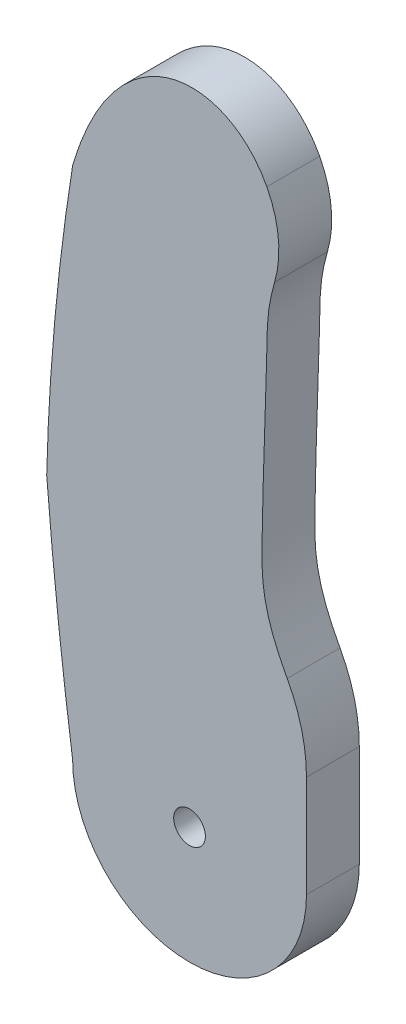
ISO-10303-21;
HEADER;
FILE_DESCRIPTION(('STEP AP214'),'2;1');
FILE_NAME('part.step','',(''),(''),'','','');
FILE_SCHEMA(('AUTOMOTIVE_DESIGN { 1 0 10303 214 1 1 1 1 }'));
ENDSEC;
DATA;
#1=APPLICATION_CONTEXT('core data for automotive mechanical design processes');
#2=APPLICATION_PROTOCOL_DEFINITION('international standard','automotive_design',2000,#1);
#3=PRODUCT_CONTEXT('',#1,'mechanical');
#4=PRODUCT('Part','Part','',(#3));
#5=PRODUCT_RELATED_PRODUCT_CATEGORY('part','',(#4));
#6=PRODUCT_DEFINITION_FORMATION('','',#4);
#7=PRODUCT_DEFINITION_CONTEXT('part definition',#1,'design');
#8=PRODUCT_DEFINITION('design','',#6,#7);
#9=PRODUCT_DEFINITION_SHAPE('','',#8);
#10=(LENGTH_UNIT() NAMED_UNIT(*) SI_UNIT(.MILLI.,.METRE.));
#11=(NAMED_UNIT(*) PLANE_ANGLE_UNIT() SI_UNIT($,.RADIAN.));
#12=(NAMED_UNIT(*) SI_UNIT($,.STERADIAN.) SOLID_ANGLE_UNIT());
#13=UNCERTAINTY_MEASURE_WITH_UNIT(LENGTH_MEASURE(1.E-05),#10,'distance_accuracy_value','');
#14=(GEOMETRIC_REPRESENTATION_CONTEXT(3) GLOBAL_UNCERTAINTY_ASSIGNED_CONTEXT((#13)) GLOBAL_UNIT_ASSIGNED_CONTEXT((#10,
#11,#12)) REPRESENTATION_CONTEXT('',''));
#15=CARTESIAN_POINT('',(0.,0.,0.));
#16=DIRECTION('',(0.,0.,1.));
#17=DIRECTION('',(1.,0.,0.));
#18=AXIS2_PLACEMENT_3D('',#15,#16,#17);
#19=CARTESIAN_POINT('',(-46.6058619597334,0.,5.));
#20=CARTESIAN_POINT('',(-45.7112575391299,-11.0890557128128,5.));
#21=CARTESIAN_POINT('',(-44.1531992134322,-22.0996926023876,5.));
#22=B_SPLINE_CURVE_WITH_KNOTS('',2,(#19,#20,#21),.UNSPECIFIED.,.F.,.F.,(3,3),(0.,1.),.UNSPECIFIED.);
#23=DIRECTION('',(0.,0.,-1.));
#24=VECTOR('',#23,1.);
#25=SURFACE_OF_LINEAR_EXTRUSION('',#22,#24);
#26=CARTESIAN_POINT('',(-46.6058619597334,0.,0.));
#27=CARTESIAN_POINT('',(-45.7112575391299,-11.0890557128128,0.));
#28=CARTESIAN_POINT('',(-44.1531992134322,-22.0996926023876,0.));
#29=B_SPLINE_CURVE_WITH_KNOTS('',2,(#26,#27,#28),.UNSPECIFIED.,.F.,.F.,(3,3),(0.,1.),.UNSPECIFIED.);
#30=CARTESIAN_POINT('',(-46.6058619597334,0.,0.));
#31=VERTEX_POINT('',#30);
#32=CARTESIAN_POINT('',(-44.1531992134322,-22.0996926023876,0.));
#33=VERTEX_POINT('',#32);
#34=EDGE_CURVE('E182',#31,#33,#29,.T.);
#35=ORIENTED_EDGE('',*,*,#34,.T.);
#36=DIRECTION('',(0.,0.,-1.));
#37=VECTOR('',#36,1.);
#38=CARTESIAN_POINT('',(-44.1531992134322,-22.0996926023876,5.));
#39=LINE('',#38,#37);
#40=CARTESIAN_POINT('',(-44.1531992134322,-22.0996926023876,5.));
#41=VERTEX_POINT('',#40);
#42=EDGE_CURVE('E11',#41,#33,#39,.T.);
#43=ORIENTED_EDGE('',*,*,#42,.F.);
#44=CARTESIAN_POINT('',(-46.6058619597334,0.,5.));
#45=VERTEX_POINT('',#44);
#46=EDGE_CURVE('E169',#45,#41,#22,.T.);
#47=ORIENTED_EDGE('',*,*,#46,.F.);
#48=DIRECTION('',(0.,0.,-1.));
#49=VECTOR('',#48,1.);
#50=CARTESIAN_POINT('',(-46.6058619597334,0.,5.));
#51=LINE('',#50,#49);
#52=EDGE_CURVE('E131',#45,#31,#51,.T.);
#53=ORIENTED_EDGE('',*,*,#52,.T.);
#54=EDGE_LOOP('',(#35,#43,#47,#53));
#55=FACE_BOUND('',#54,.T.);
#56=ADVANCED_FACE('F37',(#55),#25,.F.);
#57=CARTESIAN_POINT('',(-33.0893365251508,-22.0996926023876,5.));
#58=DIRECTION('',(0.,0.,-1.));
#59=DIRECTION('',(-1.,0.,0.));
#60=AXIS2_PLACEMENT_3D('',#57,#58,#59);
#61=CYLINDRICAL_SURFACE('',#60,11.0638626882813);
#62=CARTESIAN_POINT('',(-33.0893365251508,-22.0996926023876,0.));
#63=DIRECTION('',(0.,0.,1.));
#64=DIRECTION('',(1.,0.,0.));
#65=AXIS2_PLACEMENT_3D('',#62,#63,#64);
#66=CIRCLE('',#65,11.0638626882813);
#67=CARTESIAN_POINT('',(-22.0254738368695,-22.0996926023876,0.));
#68=VERTEX_POINT('',#67);
#69=EDGE_CURVE('E186',#33,#68,#66,.T.);
#70=ORIENTED_EDGE('',*,*,#69,.T.);
#71=DIRECTION('',(0.,0.,-1.));
#72=VECTOR('',#71,1.);
#73=CARTESIAN_POINT('',(-22.0254738368695,-22.0996926023876,5.));
#74=LINE('',#73,#72);
#75=CARTESIAN_POINT('',(-22.0254738368695,-22.0996926023876,5.));
#76=VERTEX_POINT('',#75);
#77=EDGE_CURVE('E47',#76,#68,#74,.T.);
#78=ORIENTED_EDGE('',*,*,#77,.F.);
#79=CARTESIAN_POINT('',(-33.0893365251508,-22.0996926023876,5.));
#80=DIRECTION('',(0.,0.,1.));
#81=DIRECTION('',(1.,0.,0.));
#82=AXIS2_PLACEMENT_3D('',#79,#80,#81);
#83=CIRCLE('',#82,11.0638626882813);
#84=EDGE_CURVE('E98',#41,#76,#83,.T.);
#85=ORIENTED_EDGE('',*,*,#84,.F.);
#86=ORIENTED_EDGE('',*,*,#42,.T.);
#87=EDGE_LOOP('',(#70,#78,#85,#86));
#88=FACE_BOUND('',#87,.T.);
#89=ADVANCED_FACE('F244',(#88),#61,.T.);
#90=CARTESIAN_POINT('',(-22.0254738368695,-12.4602884320922,5.));
#91=DIRECTION('',(-1.,0.,0.));
#92=DIRECTION('',(0.,-1.,0.));
#93=AXIS2_PLACEMENT_3D('',#90,#91,#92);
#94=PLANE('',#93);
#95=DIRECTION('',(0.,1.,0.));
#96=VECTOR('',#95,1.);
#97=CARTESIAN_POINT('',(-22.0254738368695,-12.4602884320922,0.));
#98=LINE('',#97,#96);
#99=CARTESIAN_POINT('',(-22.0254738368695,-12.4602884320922,0.));
#100=VERTEX_POINT('',#99);
#101=EDGE_CURVE('E190',#68,#100,#98,.T.);
#102=ORIENTED_EDGE('',*,*,#101,.T.);
#103=DIRECTION('',(0.,0.,-1.));
#104=VECTOR('',#103,1.);
#105=CARTESIAN_POINT('',(-22.0254738368695,-12.4602884320922,5.));
#106=LINE('',#105,#104);
#107=CARTESIAN_POINT('',(-22.0254738368695,-12.4602884320922,5.));
#108=VERTEX_POINT('',#107);
#109=EDGE_CURVE('E227',#108,#100,#106,.T.);
#110=ORIENTED_EDGE('',*,*,#109,.F.);
#111=DIRECTION('',(0.,1.,0.));
#112=VECTOR('',#111,1.);
#113=CARTESIAN_POINT('',(-22.0254738368695,-12.4602884320922,5.));
#114=LINE('',#113,#112);
#115=EDGE_CURVE('E167',#76,#108,#114,.T.);
#116=ORIENTED_EDGE('',*,*,#115,.F.);
#117=ORIENTED_EDGE('',*,*,#77,.T.);
#118=EDGE_LOOP('',(#102,#110,#116,#117));
#119=FACE_BOUND('',#118,.T.);
#120=ADVANCED_FACE('F234',(#119),#94,.F.);
#121=CARTESIAN_POINT('',(-37.0254738368695,-12.4602884320922,5.));
#122=DIRECTION('',(0.,0.,-1.));
#123=DIRECTION('',(-1.,0.,0.));
#124=AXIS2_PLACEMENT_3D('',#121,#122,#123);
#125=CYLINDRICAL_SURFACE('',#124,15.);
#126=CARTESIAN_POINT('',(-37.0254738368695,-12.4602884320922,0.));
#127=DIRECTION('',(0.,0.,1.));
#128=DIRECTION('',(-1.,0.,0.));
#129=AXIS2_PLACEMENT_3D('',#126,#127,#128);
#130=CIRCLE('',#129,15.);
#131=CARTESIAN_POINT('',(-23.8517565290266,-5.28720176782827,0.));
#132=VERTEX_POINT('',#131);
#133=EDGE_CURVE('E199',#100,#132,#130,.T.);
#134=ORIENTED_EDGE('',*,*,#133,.T.);
#135=DIRECTION('',(0.,0.,-1.));
#136=VECTOR('',#135,1.);
#137=CARTESIAN_POINT('',(-23.8517565290266,-5.28720176782827,5.));
#138=LINE('',#137,#136);
#139=CARTESIAN_POINT('',(-23.8517565290266,-5.28720176782827,5.));
#140=VERTEX_POINT('',#139);
#141=EDGE_CURVE('E224',#140,#132,#138,.T.);
#142=ORIENTED_EDGE('',*,*,#141,.F.);
#143=CARTESIAN_POINT('',(-37.0254738368695,-12.4602884320922,5.));
#144=DIRECTION('',(0.,0.,1.));
#145=DIRECTION('',(-1.,0.,0.));
#146=AXIS2_PLACEMENT_3D('',#143,#144,#145);
#147=CIRCLE('',#146,15.);
#148=EDGE_CURVE('E162',#108,#140,#147,.T.);
#149=ORIENTED_EDGE('',*,*,#148,.F.);
#150=ORIENTED_EDGE('',*,*,#109,.T.);
#151=EDGE_LOOP('',(#134,#142,#149,#150));
#152=FACE_BOUND('',#151,.T.);
#153=ADVANCED_FACE('F155',(#152),#125,.T.);
#154=CARTESIAN_POINT('',(-23.8517565290266,-5.28720176782827,5.));
#155=CARTESIAN_POINT('',(-26.2502571445017,-0.882240479911318,5.));
#156=CARTESIAN_POINT('',(-26.3074678451786,6.66899426599062,5.));
#157=CARTESIAN_POINT('',(-25.7197092182071,19.5048144764915,5.));
#158=CARTESIAN_POINT('',(-25.7600158726406,24.1411649653781,5.));
#159=CARTESIAN_POINT('',(-25.0422914726888,26.5821550938128,5.));
#160=B_SPLINE_CURVE_WITH_KNOTS('',3,(#154,#155,#156,#157,#158,#159),.UNSPECIFIED.,.F.,.F.,(4,1,
1,4),(0.0833383882535382,0.303134571149601,0.731012854933656,0.959193523349881),.UNSPECIFIED.);
#161=DIRECTION('',(0.,0.,-1.));
#162=VECTOR('',#161,1.);
#163=SURFACE_OF_LINEAR_EXTRUSION('',#160,#162);
#164=CARTESIAN_POINT('',(-23.8517565290266,-5.28720176782827,0.));
#165=CARTESIAN_POINT('',(-26.2502571445017,-0.882240479911318,0.));
#166=CARTESIAN_POINT('',(-26.3074678451786,6.66899426599062,0.));
#167=CARTESIAN_POINT('',(-25.7197092182071,19.5048144764915,0.));
#168=CARTESIAN_POINT('',(-25.7600158726406,24.1411649653781,0.));
#169=CARTESIAN_POINT('',(-25.0422914726888,26.5821550938128,0.));
#170=B_SPLINE_CURVE_WITH_KNOTS('',3,(#164,#165,#166,#167,#168,#169),.UNSPECIFIED.,.F.,.F.,(4,1,
1,4),(0.0833383882535382,0.303134571149601,0.731012854933656,0.959193523349881),.UNSPECIFIED.);
#171=CARTESIAN_POINT('',(-25.0422914726888,26.5821550938128,0.));
#172=VERTEX_POINT('',#171);
#173=EDGE_CURVE('E201',#132,#172,#170,.T.);
#174=ORIENTED_EDGE('',*,*,#173,.T.);
#175=DIRECTION('',(0.,0.,-1.));
#176=VECTOR('',#175,1.);
#177=CARTESIAN_POINT('',(-25.0422914726888,26.5821550938128,5.));
#178=LINE('',#177,#176);
#179=CARTESIAN_POINT('',(-25.0422914726888,26.5821550938128,5.));
#180=VERTEX_POINT('',#179);
#181=EDGE_CURVE('E126',#180,#172,#178,.T.);
#182=ORIENTED_EDGE('',*,*,#181,.F.);
#183=EDGE_CURVE('E117',#140,#180,#160,.T.);
#184=ORIENTED_EDGE('',*,*,#183,.F.);
#185=ORIENTED_EDGE('',*,*,#141,.T.);
#186=EDGE_LOOP('',(#174,#182,#184,#185));
#187=FACE_BOUND('',#186,.T.);
#188=ADVANCED_FACE('F152',(#187),#163,.F.);
#189=CARTESIAN_POINT('',(-34.6361740056399,29.4030446598781,5.));
#190=DIRECTION('',(0.,0.,-1.));
#191=DIRECTION('',(-1.,0.,0.));
#192=AXIS2_PLACEMENT_3D('',#189,#190,#191);
#193=CYLINDRICAL_SURFACE('',#192,10.);
#194=CARTESIAN_POINT('',(-34.6361740056399,29.4030446598781,0.));
#195=DIRECTION('',(0.,0.,1.));
#196=DIRECTION('',(-1.,0.,0.));
#197=AXIS2_PLACEMENT_3D('',#194,#195,#196);
#198=CIRCLE('',#197,10.);
#199=CARTESIAN_POINT('',(-25.7773883152089,34.0422165785523,0.));
#200=VERTEX_POINT('',#199);
#201=EDGE_CURVE('E125',#172,#200,#198,.T.);
#202=ORIENTED_EDGE('',*,*,#201,.T.);
#203=DIRECTION('',(0.,0.,-1.));
#204=VECTOR('',#203,1.);
#205=CARTESIAN_POINT('',(-25.7773883152089,34.0422165785523,5.));
#206=LINE('',#205,#204);
#207=CARTESIAN_POINT('',(-25.7773883152089,34.0422165785523,5.));
#208=VERTEX_POINT('',#207);
#209=EDGE_CURVE('E122',#208,#200,#206,.T.);
#210=ORIENTED_EDGE('',*,*,#209,.F.);
#211=CARTESIAN_POINT('',(-34.6361740056399,29.4030446598781,5.));
#212=DIRECTION('',(0.,0.,1.));
#213=DIRECTION('',(-1.,0.,0.));
#214=AXIS2_PLACEMENT_3D('',#211,#212,#213);
#215=CIRCLE('',#214,10.);
#216=EDGE_CURVE('E111',#180,#208,#215,.T.);
#217=ORIENTED_EDGE('',*,*,#216,.F.);
#218=ORIENTED_EDGE('',*,*,#181,.T.);
#219=EDGE_LOOP('',(#202,#210,#217,#218));
#220=FACE_BOUND('',#219,.T.);
#221=ADVANCED_FACE('F123',(#220),#193,.T.);
#222=CARTESIAN_POINT('',(-25.7773883152089,34.0422165785523,5.));
#223=CARTESIAN_POINT('',(-29.4087069674381,40.9764441255572,5.));
#224=CARTESIAN_POINT('',(-39.9004838670176,41.1834079776446,5.));
#225=CARTESIAN_POINT('',(-44.1531992134322,26.5821550938128,5.));
#226=B_SPLINE_CURVE_WITH_KNOTS('',3,(#222,#223,#224,#225),.UNSPECIFIED.,.F.,.F.,(4,4),(0.,
0.860338306806308),.UNSPECIFIED.);
#227=DIRECTION('',(0.,0.,-1.));
#228=VECTOR('',#227,1.);
#229=SURFACE_OF_LINEAR_EXTRUSION('',#226,#228);
#230=CARTESIAN_POINT('',(-25.7773883152089,34.0422165785523,0.));
#231=CARTESIAN_POINT('',(-29.4087069674381,40.9764441255572,0.));
#232=CARTESIAN_POINT('',(-39.9004838670176,41.1834079776446,0.));
#233=CARTESIAN_POINT('',(-44.1531992134322,26.5821550938128,0.));
#234=B_SPLINE_CURVE_WITH_KNOTS('',3,(#230,#231,#232,#233),.UNSPECIFIED.,.F.,.F.,(4,4),(0.,
0.860338306806308),.UNSPECIFIED.);
#235=CARTESIAN_POINT('',(-44.1531992134322,26.5821550938128,0.));
#236=VERTEX_POINT('',#235);
#237=EDGE_CURVE('E84',#200,#236,#234,.T.);
#238=ORIENTED_EDGE('',*,*,#237,.T.);
#239=DIRECTION('',(0.,0.,-1.));
#240=VECTOR('',#239,1.);
#241=CARTESIAN_POINT('',(-44.1531992134322,26.5821550938128,5.));
#242=LINE('',#241,#240);
#243=CARTESIAN_POINT('',(-44.1531992134322,26.5821550938128,5.));
#244=VERTEX_POINT('',#243);
#245=EDGE_CURVE('E127',#244,#236,#242,.T.);
#246=ORIENTED_EDGE('',*,*,#245,.F.);
#247=EDGE_CURVE('E115',#208,#244,#226,.T.);
#248=ORIENTED_EDGE('',*,*,#247,.F.);
#249=ORIENTED_EDGE('',*,*,#209,.T.);
#250=EDGE_LOOP('',(#238,#246,#248,#249));
#251=FACE_BOUND('',#250,.T.);
#252=ADVANCED_FACE('F129',(#251),#229,.F.);
#253=CARTESIAN_POINT('',(-44.1531992134322,26.5821550938128,5.));
#254=CARTESIAN_POINT('',(-46.2586926234084,13.3744841706048,5.));
#255=CARTESIAN_POINT('',(-46.6058619597334,0.,5.));
#256=B_SPLINE_CURVE_WITH_KNOTS('',2,(#253,#254,#255),.UNSPECIFIED.,.F.,.F.,(3,3),(0.,1.),.UNSPECIFIED.);
#257=DIRECTION('',(0.,0.,-1.));
#258=VECTOR('',#257,1.);
#259=SURFACE_OF_LINEAR_EXTRUSION('',#256,#258);
#260=CARTESIAN_POINT('',(-44.1531992134322,26.5821550938128,0.));
#261=CARTESIAN_POINT('',(-46.2586926234084,13.3744841706048,0.));
#262=CARTESIAN_POINT('',(-46.6058619597334,0.,0.));
#263=B_SPLINE_CURVE_WITH_KNOTS('',2,(#260,#261,#262),.UNSPECIFIED.,.F.,.F.,(3,3),(0.,1.),.UNSPECIFIED.);
#264=EDGE_CURVE('E90',#236,#31,#263,.T.);
#265=ORIENTED_EDGE('',*,*,#264,.T.);
#266=ORIENTED_EDGE('',*,*,#52,.F.);
#267=EDGE_CURVE('E55',#244,#45,#256,.T.);
#268=ORIENTED_EDGE('',*,*,#267,.F.);
#269=ORIENTED_EDGE('',*,*,#245,.T.);
#270=EDGE_LOOP('',(#265,#266,#268,#269));
#271=FACE_BOUND('',#270,.T.);
#272=ADVANCED_FACE('F148',(#271),#259,.F.);
#273=CARTESIAN_POINT('',(-45.5453940628563,-11.0694510070033,5.));
#274=DIRECTION('',(0.,0.,-1.));
#275=DIRECTION('',(-1.,0.,0.));
#276=AXIS2_PLACEMENT_3D('',#273,#274,#275);
#277=PLANE('',#276);
#278=CARTESIAN_POINT('',(-33.0893365251508,-22.0996926023876,5.));
#279=DIRECTION('',(0.,0.,1.));
#280=DIRECTION('',(1.,0.,0.));
#281=AXIS2_PLACEMENT_3D('',#278,#279,#280);
#282=CIRCLE('',#281,1.5);
#283=CARTESIAN_POINT('',(-31.5893365251508,-22.0996926023876,5.));
#284=VERTEX_POINT('',#283);
#285=EDGE_CURVE('E174',#284,#284,#282,.T.);
#286=ORIENTED_EDGE('',*,*,#285,.F.);
#287=EDGE_LOOP('',(#286));
#288=FACE_BOUND('',#287,.T.);
#289=ORIENTED_EDGE('',*,*,#46,.T.);
#290=ORIENTED_EDGE('',*,*,#84,.T.);
#291=ORIENTED_EDGE('',*,*,#115,.T.);
#292=ORIENTED_EDGE('',*,*,#148,.T.);
#293=ORIENTED_EDGE('',*,*,#183,.T.);
#294=ORIENTED_EDGE('',*,*,#216,.T.);
#295=ORIENTED_EDGE('',*,*,#247,.T.);
#296=ORIENTED_EDGE('',*,*,#267,.T.);
#297=EDGE_LOOP('',(#289,#290,#291,#292,#293,#294,#295,#296));
#298=FACE_BOUND('',#297,.T.);
#299=ADVANCED_FACE('F113',(#288,#298),#277,.F.);
#300=CARTESIAN_POINT('',(-45.5453940628563,-11.0694510070033,0.));
#301=DIRECTION('',(0.,0.,-1.));
#302=DIRECTION('',(-1.,0.,0.));
#303=AXIS2_PLACEMENT_3D('',#300,#301,#302);
#304=PLANE('',#303);
#305=CARTESIAN_POINT('',(-33.0893365251508,-22.0996926023876,0.));
#306=DIRECTION('',(0.,0.,-1.));
#307=DIRECTION('',(-1.,0.,0.));
#308=AXIS2_PLACEMENT_3D('',#305,#306,#307);
#309=CIRCLE('',#308,1.5);
#310=CARTESIAN_POINT('',(-34.5893365251508,-22.0996926023876,0.));
#311=VERTEX_POINT('',#310);
#312=EDGE_CURVE('E41',#311,#311,#309,.T.);
#313=ORIENTED_EDGE('',*,*,#312,.F.);
#314=EDGE_LOOP('',(#313));
#315=FACE_BOUND('',#314,.T.);
#316=ORIENTED_EDGE('',*,*,#34,.F.);
#317=ORIENTED_EDGE('',*,*,#264,.F.);
#318=ORIENTED_EDGE('',*,*,#237,.F.);
#319=ORIENTED_EDGE('',*,*,#201,.F.);
#320=ORIENTED_EDGE('',*,*,#173,.F.);
#321=ORIENTED_EDGE('',*,*,#133,.F.);
#322=ORIENTED_EDGE('',*,*,#101,.F.);
#323=ORIENTED_EDGE('',*,*,#69,.F.);
#324=EDGE_LOOP('',(#316,#317,#318,#319,#320,#321,#322,#323));
#325=FACE_BOUND('',#324,.T.);
#326=ADVANCED_FACE('F238',(#315,#325),#304,.T.);
#327=CARTESIAN_POINT('',(-33.0893365251508,-22.0996926023876,-10.));
#328=DIRECTION('',(0.,0.,1.));
#329=DIRECTION('',(1.,0.,0.));
#330=AXIS2_PLACEMENT_3D('',#327,#328,#329);
#331=CYLINDRICAL_SURFACE('',#330,1.5);
#332=ORIENTED_EDGE('',*,*,#312,.T.);
#333=EDGE_LOOP('',(#332));
#334=FACE_BOUND('',#333,.T.);
#335=ORIENTED_EDGE('',*,*,#285,.T.);
#336=EDGE_LOOP('',(#335));
#337=FACE_BOUND('',#336,.T.);
#338=ADVANCED_FACE('F312',(#334,#337),#331,.F.);
#339=CLOSED_SHELL('',(#56,#89,#120,#153,#188,#221,#252,#272,#299,#326,#338));
#340=MANIFOLD_SOLID_BREP('B2',#339);
#341=ADVANCED_BREP_SHAPE_REPRESENTATION('',(#18,#340),#14);
#342=SHAPE_DEFINITION_REPRESENTATION(#9,#341);
ENDSEC;
END-ISO-10303-21;
